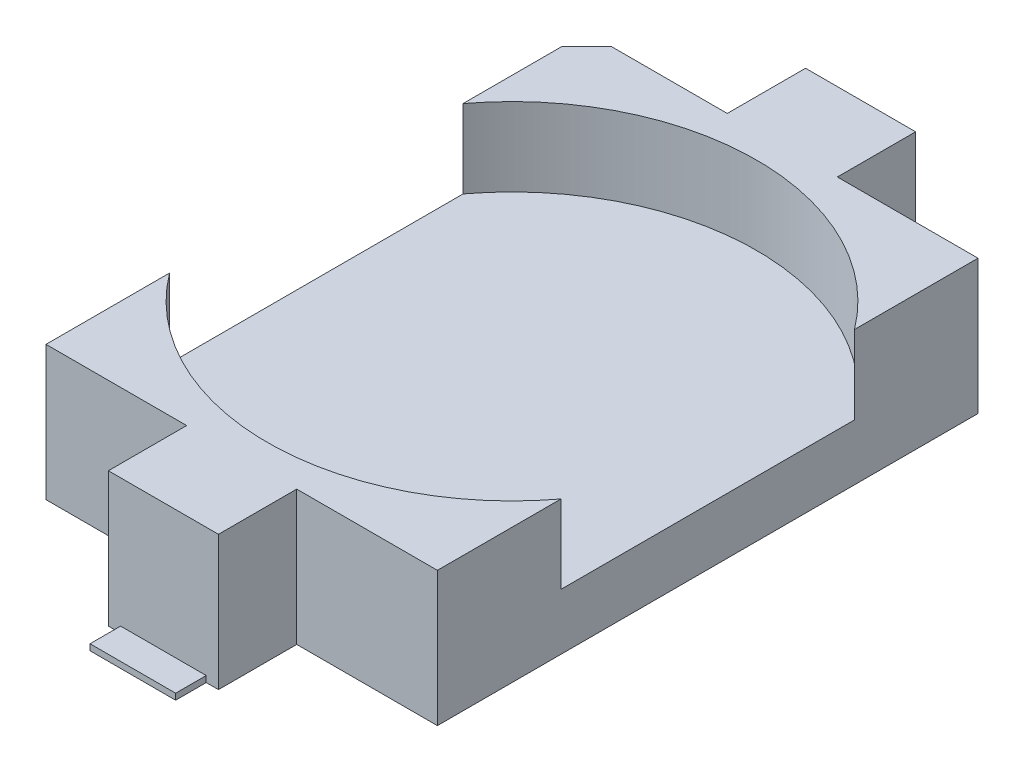
ISO-10303-21;
HEADER;
FILE_DESCRIPTION(('STEP AP214'),'2;1');
FILE_NAME('part.step','',(''),(''),'','','');
FILE_SCHEMA(('AUTOMOTIVE_DESIGN { 1 0 10303 214 1 1 1 1 }'));
ENDSEC;
DATA;
#1=APPLICATION_CONTEXT('core data for automotive mechanical design processes');
#2=APPLICATION_PROTOCOL_DEFINITION('international standard','automotive_design',2000,#1);
#3=PRODUCT_CONTEXT('',#1,'mechanical');
#4=PRODUCT('Part','Part','',(#3));
#5=PRODUCT_RELATED_PRODUCT_CATEGORY('part','',(#4));
#6=PRODUCT_DEFINITION_FORMATION('','',#4);
#7=PRODUCT_DEFINITION_CONTEXT('part definition',#1,'design');
#8=PRODUCT_DEFINITION('design','',#6,#7);
#9=PRODUCT_DEFINITION_SHAPE('','',#8);
#10=(LENGTH_UNIT() NAMED_UNIT(*) SI_UNIT(.MILLI.,.METRE.));
#11=(NAMED_UNIT(*) PLANE_ANGLE_UNIT() SI_UNIT($,.RADIAN.));
#12=(NAMED_UNIT(*) SI_UNIT($,.STERADIAN.) SOLID_ANGLE_UNIT());
#13=UNCERTAINTY_MEASURE_WITH_UNIT(LENGTH_MEASURE(1.E-05),#10,'distance_accuracy_value','');
#14=(GEOMETRIC_REPRESENTATION_CONTEXT(3) GLOBAL_UNCERTAINTY_ASSIGNED_CONTEXT((#13)) GLOBAL_UNIT_ASSIGNED_CONTEXT((#10,
#11,#12)) REPRESENTATION_CONTEXT('',''));
#15=CARTESIAN_POINT('',(0.,0.,0.));
#16=DIRECTION('',(0.,0.,1.));
#17=DIRECTION('',(1.,0.,0.));
#18=AXIS2_PLACEMENT_3D('',#15,#16,#17);
#19=CARTESIAN_POINT('',(0.,5.5,0.));
#20=DIRECTION('',(0.,1.,0.));
#21=DIRECTION('',(0.,0.,1.));
#22=AXIS2_PLACEMENT_3D('',#19,#20,#21);
#23=PLANE('',#22);
#24=DIRECTION('',(1.,0.,0.));
#25=VECTOR('',#24,1.);
#26=CARTESIAN_POINT('',(0.,5.5,-11.0499999999999));
#27=LINE('',#26,#25);
#28=CARTESIAN_POINT('',(-7.00000000000004,5.5,-11.0499999999999));
#29=VERTEX_POINT('',#28);
#30=CARTESIAN_POINT('',(-2.25,5.5,-11.0499999999999));
#31=VERTEX_POINT('',#30);
#32=EDGE_CURVE('E309',#29,#31,#27,.T.);
#33=ORIENTED_EDGE('',*,*,#32,.F.);
#34=DIRECTION('',(-0.707106781186549,0.,0.707106781186546));
#35=VECTOR('',#34,1.);
#36=CARTESIAN_POINT('',(-9.02499999999995,5.5,-9.02499999999998));
#37=LINE('',#36,#35);
#38=CARTESIAN_POINT('',(-8.00000000000005,5.5,-10.0499999999999));
#39=VERTEX_POINT('',#38);
#40=EDGE_CURVE('E47',#29,#39,#37,.T.);
#41=ORIENTED_EDGE('',*,*,#40,.T.);
#42=DIRECTION('',(0.,0.,1.));
#43=VECTOR('',#42,1.);
#44=CARTESIAN_POINT('',(-8.00000000000005,5.5,0.));
#45=LINE('',#44,#43);
#46=CARTESIAN_POINT('',(-8.00000000000005,5.5,-5.99999999999994));
#47=VERTEX_POINT('',#46);
#48=EDGE_CURVE('E312',#39,#47,#45,.T.);
#49=ORIENTED_EDGE('',*,*,#48,.T.);
#50=CARTESIAN_POINT('',(0.,5.5,0.));
#51=DIRECTION('',(0.,1.,0.));
#52=DIRECTION('',(0.,0.,1.));
#53=AXIS2_PLACEMENT_3D('',#50,#51,#52);
#54=CIRCLE('',#53,10.);
#55=CARTESIAN_POINT('',(7.99999999999995,5.5,-6.00000000000006));
#56=VERTEX_POINT('',#55);
#57=EDGE_CURVE('E376',#56,#47,#54,.T.);
#58=ORIENTED_EDGE('',*,*,#57,.F.);
#59=DIRECTION('',(0.,0.,1.));
#60=VECTOR('',#59,1.);
#61=CARTESIAN_POINT('',(7.99999999999995,5.5,0.));
#62=LINE('',#61,#60);
#63=CARTESIAN_POINT('',(7.99999999999995,5.5,-11.0499999999999));
#64=VERTEX_POINT('',#63);
#65=EDGE_CURVE('E294',#64,#56,#62,.T.);
#66=ORIENTED_EDGE('',*,*,#65,.F.);
#67=DIRECTION('',(1.,0.,0.));
#68=VECTOR('',#67,1.);
#69=CARTESIAN_POINT('',(0.,5.5,-11.0499999999999));
#70=LINE('',#69,#68);
#71=CARTESIAN_POINT('',(2.25,5.5,-11.0499999999999));
#72=VERTEX_POINT('',#71);
#73=EDGE_CURVE('E297',#72,#64,#70,.T.);
#74=ORIENTED_EDGE('',*,*,#73,.F.);
#75=DIRECTION('',(0.,0.,1.));
#76=VECTOR('',#75,1.);
#77=CARTESIAN_POINT('',(2.25,5.5,0.));
#78=LINE('',#77,#76);
#79=CARTESIAN_POINT('',(2.25,5.5,-14.25));
#80=VERTEX_POINT('',#79);
#81=EDGE_CURVE('E300',#80,#72,#78,.T.);
#82=ORIENTED_EDGE('',*,*,#81,.F.);
#83=DIRECTION('',(1.,0.,0.));
#84=VECTOR('',#83,1.);
#85=CARTESIAN_POINT('',(0.,5.5,-14.25));
#86=LINE('',#85,#84);
#87=CARTESIAN_POINT('',(-2.25,5.5,-14.25));
#88=VERTEX_POINT('',#87);
#89=EDGE_CURVE('E303',#88,#80,#86,.T.);
#90=ORIENTED_EDGE('',*,*,#89,.F.);
#91=DIRECTION('',(0.,0.,1.));
#92=VECTOR('',#91,1.);
#93=CARTESIAN_POINT('',(-2.25,5.5,0.));
#94=LINE('',#93,#92);
#95=EDGE_CURVE('E306',#88,#31,#94,.T.);
#96=ORIENTED_EDGE('',*,*,#95,.T.);
#97=EDGE_LOOP('',(#33,#41,#49,#58,#66,#74,#82,#90,#96));
#98=FACE_BOUND('',#97,.T.);
#99=ADVANCED_FACE('F38',(#98),#23,.T.);
#100=CARTESIAN_POINT('',(0.,5.5,11.0500000000001));
#101=DIRECTION('',(0.,0.,-1.));
#102=DIRECTION('',(-1.,0.,0.));
#103=AXIS2_PLACEMENT_3D('',#100,#101,#102);
#104=PLANE('',#103);
#105=DIRECTION('',(1.,0.,0.));
#106=VECTOR('',#105,1.);
#107=CARTESIAN_POINT('',(0.,0.,11.0500000000001));
#108=LINE('',#107,#106);
#109=CARTESIAN_POINT('',(-8.00000000000004,0.,11.0500000000001));
#110=VERTEX_POINT('',#109);
#111=CARTESIAN_POINT('',(-2.25,0.,11.0500000000001));
#112=VERTEX_POINT('',#111);
#113=EDGE_CURVE('E278',#110,#112,#108,.T.);
#114=ORIENTED_EDGE('',*,*,#113,.T.);
#115=DIRECTION('',(0.,-1.,0.));
#116=VECTOR('',#115,1.);
#117=CARTESIAN_POINT('',(-2.25,5.5,11.0500000000001));
#118=LINE('',#117,#116);
#119=CARTESIAN_POINT('',(-2.25,5.5,11.0500000000001));
#120=VERTEX_POINT('',#119);
#121=EDGE_CURVE('E371',#120,#112,#118,.T.);
#122=ORIENTED_EDGE('',*,*,#121,.F.);
#123=DIRECTION('',(1.,0.,0.));
#124=VECTOR('',#123,1.);
#125=CARTESIAN_POINT('',(0.,5.5,11.0500000000001));
#126=LINE('',#125,#124);
#127=CARTESIAN_POINT('',(-8.00000000000004,5.5,11.0500000000001));
#128=VERTEX_POINT('',#127);
#129=EDGE_CURVE('E279',#128,#120,#126,.T.);
#130=ORIENTED_EDGE('',*,*,#129,.F.);
#131=DIRECTION('',(0.,-1.,0.));
#132=VECTOR('',#131,1.);
#133=CARTESIAN_POINT('',(-8.00000000000004,5.5,11.0500000000001));
#134=LINE('',#133,#132);
#135=EDGE_CURVE('E314',#128,#110,#134,.T.);
#136=ORIENTED_EDGE('',*,*,#135,.T.);
#137=EDGE_LOOP('',(#114,#122,#130,#136));
#138=FACE_BOUND('',#137,.T.);
#139=ADVANCED_FACE('F472',(#138),#104,.F.);
#140=CARTESIAN_POINT('',(-2.25,5.5,0.));
#141=DIRECTION('',(1.,0.,0.));
#142=DIRECTION('',(0.,0.,-1.));
#143=AXIS2_PLACEMENT_3D('',#140,#141,#142);
#144=PLANE('',#143);
#145=DIRECTION('',(0.,0.,1.));
#146=VECTOR('',#145,1.);
#147=CARTESIAN_POINT('',(-2.25,0.,0.));
#148=LINE('',#147,#146);
#149=CARTESIAN_POINT('',(-2.25,0.,14.25));
#150=VERTEX_POINT('',#149);
#151=EDGE_CURVE('E317',#112,#150,#148,.T.);
#152=ORIENTED_EDGE('',*,*,#151,.T.);
#153=DIRECTION('',(0.,-1.,0.));
#154=VECTOR('',#153,1.);
#155=CARTESIAN_POINT('',(-2.25,5.5,14.25));
#156=LINE('',#155,#154);
#157=CARTESIAN_POINT('',(-2.25,5.5,14.25));
#158=VERTEX_POINT('',#157);
#159=EDGE_CURVE('E368',#158,#150,#156,.T.);
#160=ORIENTED_EDGE('',*,*,#159,.F.);
#161=DIRECTION('',(0.,0.,1.));
#162=VECTOR('',#161,1.);
#163=CARTESIAN_POINT('',(-2.25,5.5,0.));
#164=LINE('',#163,#162);
#165=EDGE_CURVE('E282',#120,#158,#164,.T.);
#166=ORIENTED_EDGE('',*,*,#165,.F.);
#167=ORIENTED_EDGE('',*,*,#121,.T.);
#168=EDGE_LOOP('',(#152,#160,#166,#167));
#169=FACE_BOUND('',#168,.T.);
#170=ADVANCED_FACE('F478',(#169),#144,.F.);
#171=CARTESIAN_POINT('',(0.,5.5,14.25));
#172=DIRECTION('',(0.,0.,-1.));
#173=DIRECTION('',(-1.,0.,0.));
#174=AXIS2_PLACEMENT_3D('',#171,#172,#173);
#175=PLANE('',#174);
#176=DIRECTION('',(-1.,0.,0.));
#177=VECTOR('',#176,1.);
#178=CARTESIAN_POINT('',(0.,0.25,14.25));
#179=LINE('',#178,#177);
#180=CARTESIAN_POINT('',(1.75,0.25,14.25));
#181=VERTEX_POINT('',#180);
#182=CARTESIAN_POINT('',(-1.75,0.25,14.25));
#183=VERTEX_POINT('',#182);
#184=EDGE_CURVE('E58',#181,#183,#179,.T.);
#185=ORIENTED_EDGE('',*,*,#184,.F.);
#186=DIRECTION('',(0.,-1.,0.));
#187=VECTOR('',#186,1.);
#188=CARTESIAN_POINT('',(1.75,5.5,14.25));
#189=LINE('',#188,#187);
#190=CARTESIAN_POINT('',(1.75,0.,14.25));
#191=VERTEX_POINT('',#190);
#192=EDGE_CURVE('E211',#181,#191,#189,.T.);
#193=ORIENTED_EDGE('',*,*,#192,.T.);
#194=DIRECTION('',(1.,0.,0.));
#195=VECTOR('',#194,1.);
#196=CARTESIAN_POINT('',(0.,0.,14.25));
#197=LINE('',#196,#195);
#198=CARTESIAN_POINT('',(2.25,0.,14.25));
#199=VERTEX_POINT('',#198);
#200=EDGE_CURVE('E319',#191,#199,#197,.T.);
#201=ORIENTED_EDGE('',*,*,#200,.T.);
#202=DIRECTION('',(0.,-1.,0.));
#203=VECTOR('',#202,1.);
#204=CARTESIAN_POINT('',(2.25,5.5,14.25));
#205=LINE('',#204,#203);
#206=CARTESIAN_POINT('',(2.25,5.5,14.25));
#207=VERTEX_POINT('',#206);
#208=EDGE_CURVE('E365',#207,#199,#205,.T.);
#209=ORIENTED_EDGE('',*,*,#208,.F.);
#210=DIRECTION('',(1.,0.,0.));
#211=VECTOR('',#210,1.);
#212=CARTESIAN_POINT('',(0.,5.5,14.25));
#213=LINE('',#212,#211);
#214=EDGE_CURVE('E285',#158,#207,#213,.T.);
#215=ORIENTED_EDGE('',*,*,#214,.F.);
#216=ORIENTED_EDGE('',*,*,#159,.T.);
#217=CARTESIAN_POINT('',(-1.75,0.,14.25));
#218=VERTEX_POINT('',#217);
#219=EDGE_CURVE('E320',#150,#218,#197,.T.);
#220=ORIENTED_EDGE('',*,*,#219,.T.);
#221=DIRECTION('',(0.,1.,0.));
#222=VECTOR('',#221,1.);
#223=CARTESIAN_POINT('',(-1.75,5.5,14.25));
#224=LINE('',#223,#222);
#225=EDGE_CURVE('E54',#218,#183,#224,.T.);
#226=ORIENTED_EDGE('',*,*,#225,.T.);
#227=EDGE_LOOP('',(#185,#193,#201,#209,#215,#216,#220,#226));
#228=FACE_BOUND('',#227,.T.);
#229=ADVANCED_FACE('F456',(#228),#175,.F.);
#230=CARTESIAN_POINT('',(2.25,5.5,0.));
#231=DIRECTION('',(1.,0.,0.));
#232=DIRECTION('',(0.,0.,-1.));
#233=AXIS2_PLACEMENT_3D('',#230,#231,#232);
#234=PLANE('',#233);
#235=DIRECTION('',(0.,0.,1.));
#236=VECTOR('',#235,1.);
#237=CARTESIAN_POINT('',(2.25,0.,0.));
#238=LINE('',#237,#236);
#239=CARTESIAN_POINT('',(2.25,0.,11.0500000000001));
#240=VERTEX_POINT('',#239);
#241=EDGE_CURVE('E322',#240,#199,#238,.T.);
#242=ORIENTED_EDGE('',*,*,#241,.F.);
#243=DIRECTION('',(0.,-1.,0.));
#244=VECTOR('',#243,1.);
#245=CARTESIAN_POINT('',(2.25,5.5,11.0500000000001));
#246=LINE('',#245,#244);
#247=CARTESIAN_POINT('',(2.25,5.5,11.0500000000001));
#248=VERTEX_POINT('',#247);
#249=EDGE_CURVE('E363',#248,#240,#246,.T.);
#250=ORIENTED_EDGE('',*,*,#249,.F.);
#251=DIRECTION('',(0.,0.,1.));
#252=VECTOR('',#251,1.);
#253=CARTESIAN_POINT('',(2.25,5.5,0.));
#254=LINE('',#253,#252);
#255=EDGE_CURVE('E287',#248,#207,#254,.T.);
#256=ORIENTED_EDGE('',*,*,#255,.T.);
#257=ORIENTED_EDGE('',*,*,#208,.T.);
#258=EDGE_LOOP('',(#242,#250,#256,#257));
#259=FACE_BOUND('',#258,.T.);
#260=ADVANCED_FACE('F452',(#259),#234,.T.);
#261=CARTESIAN_POINT('',(0.,5.5,11.0500000000001));
#262=DIRECTION('',(0.,0.,-1.));
#263=DIRECTION('',(-1.,0.,0.));
#264=AXIS2_PLACEMENT_3D('',#261,#262,#263);
#265=PLANE('',#264);
#266=DIRECTION('',(1.,0.,0.));
#267=VECTOR('',#266,1.);
#268=CARTESIAN_POINT('',(0.,0.,11.0500000000001));
#269=LINE('',#268,#267);
#270=CARTESIAN_POINT('',(7.99999999999995,0.,11.0500000000001));
#271=VERTEX_POINT('',#270);
#272=EDGE_CURVE('E325',#240,#271,#269,.T.);
#273=ORIENTED_EDGE('',*,*,#272,.T.);
#274=DIRECTION('',(0.,-1.,0.));
#275=VECTOR('',#274,1.);
#276=CARTESIAN_POINT('',(7.99999999999995,5.5,11.0500000000001));
#277=LINE('',#276,#275);
#278=CARTESIAN_POINT('',(7.99999999999995,5.5,11.0500000000001));
#279=VERTEX_POINT('',#278);
#280=EDGE_CURVE('E361',#279,#271,#277,.T.);
#281=ORIENTED_EDGE('',*,*,#280,.F.);
#282=DIRECTION('',(1.,0.,0.));
#283=VECTOR('',#282,1.);
#284=CARTESIAN_POINT('',(0.,5.5,11.0500000000001));
#285=LINE('',#284,#283);
#286=EDGE_CURVE('E290',#248,#279,#285,.T.);
#287=ORIENTED_EDGE('',*,*,#286,.F.);
#288=ORIENTED_EDGE('',*,*,#249,.T.);
#289=EDGE_LOOP('',(#273,#281,#287,#288));
#290=FACE_BOUND('',#289,.T.);
#291=ADVANCED_FACE('F449',(#290),#265,.F.);
#292=CARTESIAN_POINT('',(7.99999999999995,5.5,0.));
#293=DIRECTION('',(1.,0.,0.));
#294=DIRECTION('',(0.,0.,-1.));
#295=AXIS2_PLACEMENT_3D('',#292,#293,#294);
#296=PLANE('',#295);
#297=DIRECTION('',(0.,1.,0.));
#298=VECTOR('',#297,1.);
#299=CARTESIAN_POINT('',(7.99999999999995,2.3,-6.00000000000006));
#300=LINE('',#299,#298);
#301=CARTESIAN_POINT('',(7.99999999999995,2.3,-6.00000000000006));
#302=VERTEX_POINT('',#301);
#303=EDGE_CURVE('E273',#302,#56,#300,.T.);
#304=ORIENTED_EDGE('',*,*,#303,.F.);
#305=DIRECTION('',(0.,0.,1.));
#306=VECTOR('',#305,1.);
#307=CARTESIAN_POINT('',(7.99999999999995,2.3,0.));
#308=LINE('',#307,#306);
#309=CARTESIAN_POINT('',(7.99999999999995,2.3,6.00000000000006));
#310=VERTEX_POINT('',#309);
#311=EDGE_CURVE('E275',#302,#310,#308,.T.);
#312=ORIENTED_EDGE('',*,*,#311,.T.);
#313=DIRECTION('',(0.,1.,0.));
#314=VECTOR('',#313,1.);
#315=CARTESIAN_POINT('',(7.99999999999995,2.3,6.00000000000006));
#316=LINE('',#315,#314);
#317=CARTESIAN_POINT('',(7.99999999999995,5.5,6.00000000000006));
#318=VERTEX_POINT('',#317);
#319=EDGE_CURVE('E271',#318,#310,#316,.F.);
#320=ORIENTED_EDGE('',*,*,#319,.F.);
#321=EDGE_CURVE('E293',#318,#279,#62,.T.);
#322=ORIENTED_EDGE('',*,*,#321,.T.);
#323=ORIENTED_EDGE('',*,*,#280,.T.);
#324=DIRECTION('',(0.,0.,1.));
#325=VECTOR('',#324,1.);
#326=CARTESIAN_POINT('',(7.99999999999995,0.,0.));
#327=LINE('',#326,#325);
#328=CARTESIAN_POINT('',(7.99999999999995,0.,-11.0499999999999));
#329=VERTEX_POINT('',#328);
#330=EDGE_CURVE('E328',#329,#271,#327,.T.);
#331=ORIENTED_EDGE('',*,*,#330,.F.);
#332=DIRECTION('',(0.,-1.,0.));
#333=VECTOR('',#332,1.);
#334=CARTESIAN_POINT('',(7.99999999999995,5.5,-11.0499999999999));
#335=LINE('',#334,#333);
#336=EDGE_CURVE('E359',#64,#329,#335,.T.);
#337=ORIENTED_EDGE('',*,*,#336,.F.);
#338=ORIENTED_EDGE('',*,*,#65,.T.);
#339=EDGE_LOOP('',(#304,#312,#320,#322,#323,#331,#337,#338));
#340=FACE_BOUND('',#339,.T.);
#341=ADVANCED_FACE('F443',(#340),#296,.T.);
#342=CARTESIAN_POINT('',(0.,5.5,-11.0499999999999));
#343=DIRECTION('',(0.,0.,-1.));
#344=DIRECTION('',(-1.,0.,0.));
#345=AXIS2_PLACEMENT_3D('',#342,#343,#344);
#346=PLANE('',#345);
#347=DIRECTION('',(1.,0.,0.));
#348=VECTOR('',#347,1.);
#349=CARTESIAN_POINT('',(0.,0.,-11.0499999999999));
#350=LINE('',#349,#348);
#351=CARTESIAN_POINT('',(2.25,0.,-11.0499999999999));
#352=VERTEX_POINT('',#351);
#353=EDGE_CURVE('E331',#352,#329,#350,.T.);
#354=ORIENTED_EDGE('',*,*,#353,.F.);
#355=DIRECTION('',(0.,-1.,0.));
#356=VECTOR('',#355,1.);
#357=CARTESIAN_POINT('',(2.25,5.5,-11.0499999999999));
#358=LINE('',#357,#356);
#359=EDGE_CURVE('E357',#72,#352,#358,.T.);
#360=ORIENTED_EDGE('',*,*,#359,.F.);
#361=ORIENTED_EDGE('',*,*,#73,.T.);
#362=ORIENTED_EDGE('',*,*,#336,.T.);
#363=EDGE_LOOP('',(#354,#360,#361,#362));
#364=FACE_BOUND('',#363,.T.);
#365=ADVANCED_FACE('F438',(#364),#346,.T.);
#366=CARTESIAN_POINT('',(2.25,5.5,0.));
#367=DIRECTION('',(1.,0.,0.));
#368=DIRECTION('',(0.,0.,-1.));
#369=AXIS2_PLACEMENT_3D('',#366,#367,#368);
#370=PLANE('',#369);
#371=DIRECTION('',(0.,0.,1.));
#372=VECTOR('',#371,1.);
#373=CARTESIAN_POINT('',(2.25,0.,0.));
#374=LINE('',#373,#372);
#375=CARTESIAN_POINT('',(2.25,0.,-14.25));
#376=VERTEX_POINT('',#375);
#377=EDGE_CURVE('E334',#376,#352,#374,.T.);
#378=ORIENTED_EDGE('',*,*,#377,.F.);
#379=DIRECTION('',(0.,-1.,0.));
#380=VECTOR('',#379,1.);
#381=CARTESIAN_POINT('',(2.25,5.5,-14.25));
#382=LINE('',#381,#380);
#383=EDGE_CURVE('E354',#80,#376,#382,.T.);
#384=ORIENTED_EDGE('',*,*,#383,.F.);
#385=ORIENTED_EDGE('',*,*,#81,.T.);
#386=ORIENTED_EDGE('',*,*,#359,.T.);
#387=EDGE_LOOP('',(#378,#384,#385,#386));
#388=FACE_BOUND('',#387,.T.);
#389=ADVANCED_FACE('F433',(#388),#370,.T.);
#390=CARTESIAN_POINT('',(0.,5.5,-14.25));
#391=DIRECTION('',(0.,0.,-1.));
#392=DIRECTION('',(-1.,0.,0.));
#393=AXIS2_PLACEMENT_3D('',#390,#391,#392);
#394=PLANE('',#393);
#395=DIRECTION('',(0.,-1.,0.));
#396=VECTOR('',#395,1.);
#397=CARTESIAN_POINT('',(1.75,5.5,-14.25));
#398=LINE('',#397,#396);
#399=CARTESIAN_POINT('',(1.75,0.25,-14.25));
#400=VERTEX_POINT('',#399);
#401=CARTESIAN_POINT('',(1.75,0.,-14.25));
#402=VERTEX_POINT('',#401);
#403=EDGE_CURVE('E256',#400,#402,#398,.T.);
#404=ORIENTED_EDGE('',*,*,#403,.F.);
#405=DIRECTION('',(-1.,0.,0.));
#406=VECTOR('',#405,1.);
#407=CARTESIAN_POINT('',(0.,0.25,-14.25));
#408=LINE('',#407,#406);
#409=CARTESIAN_POINT('',(-1.75,0.25,-14.25));
#410=VERTEX_POINT('',#409);
#411=EDGE_CURVE('E11',#400,#410,#408,.T.);
#412=ORIENTED_EDGE('',*,*,#411,.T.);
#413=DIRECTION('',(0.,1.,0.));
#414=VECTOR('',#413,1.);
#415=CARTESIAN_POINT('',(-1.75,5.5,-14.25));
#416=LINE('',#415,#414);
#417=CARTESIAN_POINT('',(-1.75,0.,-14.25));
#418=VERTEX_POINT('',#417);
#419=EDGE_CURVE('E249',#418,#410,#416,.T.);
#420=ORIENTED_EDGE('',*,*,#419,.F.);
#421=DIRECTION('',(1.,0.,0.));
#422=VECTOR('',#421,1.);
#423=CARTESIAN_POINT('',(0.,0.,-14.25));
#424=LINE('',#423,#422);
#425=CARTESIAN_POINT('',(-2.25,0.,-14.25));
#426=VERTEX_POINT('',#425);
#427=EDGE_CURVE('E338',#426,#418,#424,.T.);
#428=ORIENTED_EDGE('',*,*,#427,.F.);
#429=DIRECTION('',(0.,-1.,0.));
#430=VECTOR('',#429,1.);
#431=CARTESIAN_POINT('',(-2.25,5.5,-14.25));
#432=LINE('',#431,#430);
#433=EDGE_CURVE('E352',#88,#426,#432,.T.);
#434=ORIENTED_EDGE('',*,*,#433,.F.);
#435=ORIENTED_EDGE('',*,*,#89,.T.);
#436=ORIENTED_EDGE('',*,*,#383,.T.);
#437=EDGE_CURVE('E337',#402,#376,#424,.T.);
#438=ORIENTED_EDGE('',*,*,#437,.F.);
#439=EDGE_LOOP('',(#404,#412,#420,#428,#434,#435,#436,#438));
#440=FACE_BOUND('',#439,.T.);
#441=ADVANCED_FACE('F413',(#440),#394,.T.);
#442=CARTESIAN_POINT('',(-2.25,5.5,0.));
#443=DIRECTION('',(1.,0.,0.));
#444=DIRECTION('',(0.,0.,-1.));
#445=AXIS2_PLACEMENT_3D('',#442,#443,#444);
#446=PLANE('',#445);
#447=DIRECTION('',(0.,0.,1.));
#448=VECTOR('',#447,1.);
#449=CARTESIAN_POINT('',(-2.25,0.,0.));
#450=LINE('',#449,#448);
#451=CARTESIAN_POINT('',(-2.25,0.,-11.0499999999999));
#452=VERTEX_POINT('',#451);
#453=EDGE_CURVE('E341',#426,#452,#450,.T.);
#454=ORIENTED_EDGE('',*,*,#453,.T.);
#455=DIRECTION('',(0.,-1.,0.));
#456=VECTOR('',#455,1.);
#457=CARTESIAN_POINT('',(-2.25,5.5,-11.0499999999999));
#458=LINE('',#457,#456);
#459=EDGE_CURVE('E349',#31,#452,#458,.T.);
#460=ORIENTED_EDGE('',*,*,#459,.F.);
#461=ORIENTED_EDGE('',*,*,#95,.F.);
#462=ORIENTED_EDGE('',*,*,#433,.T.);
#463=EDGE_LOOP('',(#454,#460,#461,#462));
#464=FACE_BOUND('',#463,.T.);
#465=ADVANCED_FACE('F408',(#464),#446,.F.);
#466=CARTESIAN_POINT('',(0.,5.5,-11.0499999999999));
#467=DIRECTION('',(0.,0.,-1.));
#468=DIRECTION('',(-1.,0.,0.));
#469=AXIS2_PLACEMENT_3D('',#466,#467,#468);
#470=PLANE('',#469);
#471=DIRECTION('',(1.,0.,0.));
#472=VECTOR('',#471,1.);
#473=CARTESIAN_POINT('',(0.,0.,-11.0499999999999));
#474=LINE('',#473,#472);
#475=CARTESIAN_POINT('',(-7.00000000000004,0.,-11.0499999999999));
#476=VERTEX_POINT('',#475);
#477=EDGE_CURVE('E344',#476,#452,#474,.T.);
#478=ORIENTED_EDGE('',*,*,#477,.F.);
#479=DIRECTION('',(0.,1.,0.));
#480=VECTOR('',#479,1.);
#481=CARTESIAN_POINT('',(-7.00000000000004,5.5,-11.0499999999999));
#482=LINE('',#481,#480);
#483=EDGE_CURVE('E384',#476,#29,#482,.T.);
#484=ORIENTED_EDGE('',*,*,#483,.T.);
#485=ORIENTED_EDGE('',*,*,#32,.T.);
#486=ORIENTED_EDGE('',*,*,#459,.T.);
#487=EDGE_LOOP('',(#478,#484,#485,#486));
#488=FACE_BOUND('',#487,.T.);
#489=ADVANCED_FACE('F404',(#488),#470,.T.);
#490=CARTESIAN_POINT('',(-8.00000000000005,5.5,0.));
#491=DIRECTION('',(1.,0.,0.));
#492=DIRECTION('',(0.,0.,-1.));
#493=AXIS2_PLACEMENT_3D('',#490,#491,#492);
#494=PLANE('',#493);
#495=ORIENTED_EDGE('',*,*,#48,.F.);
#496=DIRECTION('',(0.,-1.,0.));
#497=VECTOR('',#496,1.);
#498=CARTESIAN_POINT('',(-8.00000000000005,0.,-10.0499999999999));
#499=LINE('',#498,#497);
#500=CARTESIAN_POINT('',(-8.00000000000005,0.,-10.0499999999999));
#501=VERTEX_POINT('',#500);
#502=EDGE_CURVE('E379',#39,#501,#499,.T.);
#503=ORIENTED_EDGE('',*,*,#502,.T.);
#504=DIRECTION('',(0.,0.,1.));
#505=VECTOR('',#504,1.);
#506=CARTESIAN_POINT('',(-8.00000000000005,0.,0.));
#507=LINE('',#506,#505);
#508=EDGE_CURVE('E283',#501,#110,#507,.T.);
#509=ORIENTED_EDGE('',*,*,#508,.T.);
#510=ORIENTED_EDGE('',*,*,#135,.F.);
#511=CARTESIAN_POINT('',(-8.00000000000004,5.5,5.99999999999994));
#512=VERTEX_POINT('',#511);
#513=EDGE_CURVE('E311',#512,#128,#45,.T.);
#514=ORIENTED_EDGE('',*,*,#513,.F.);
#515=DIRECTION('',(0.,1.,0.));
#516=VECTOR('',#515,1.);
#517=CARTESIAN_POINT('',(-8.00000000000004,2.3,5.99999999999994));
#518=LINE('',#517,#516);
#519=CARTESIAN_POINT('',(-8.00000000000004,2.3,5.99999999999994));
#520=VERTEX_POINT('',#519);
#521=EDGE_CURVE('E265',#512,#520,#518,.F.);
#522=ORIENTED_EDGE('',*,*,#521,.T.);
#523=DIRECTION('',(0.,0.,1.));
#524=VECTOR('',#523,1.);
#525=CARTESIAN_POINT('',(-8.00000000000005,2.3,0.));
#526=LINE('',#525,#524);
#527=CARTESIAN_POINT('',(-8.00000000000005,2.3,-5.99999999999994));
#528=VERTEX_POINT('',#527);
#529=EDGE_CURVE('E377',#528,#520,#526,.T.);
#530=ORIENTED_EDGE('',*,*,#529,.F.);
#531=DIRECTION('',(0.,1.,0.));
#532=VECTOR('',#531,1.);
#533=CARTESIAN_POINT('',(-8.00000000000005,2.3,-5.99999999999994));
#534=LINE('',#533,#532);
#535=EDGE_CURVE('E268',#528,#47,#534,.T.);
#536=ORIENTED_EDGE('',*,*,#535,.T.);
#537=EDGE_LOOP('',(#495,#503,#509,#510,#514,#522,#530,#536));
#538=FACE_BOUND('',#537,.T.);
#539=ADVANCED_FACE('F395',(#538),#494,.F.);
#540=EDGE_CURVE('E374',#512,#318,#54,.T.);
#541=ORIENTED_EDGE('',*,*,#540,.F.);
#542=ORIENTED_EDGE('',*,*,#513,.T.);
#543=ORIENTED_EDGE('',*,*,#129,.T.);
#544=ORIENTED_EDGE('',*,*,#165,.T.);
#545=ORIENTED_EDGE('',*,*,#214,.T.);
#546=ORIENTED_EDGE('',*,*,#255,.F.);
#547=ORIENTED_EDGE('',*,*,#286,.T.);
#548=ORIENTED_EDGE('',*,*,#321,.F.);
#549=EDGE_LOOP('',(#541,#542,#543,#544,#545,#546,#547,#548));
#550=FACE_BOUND('',#549,.T.);
#551=ADVANCED_FACE('F474',(#550),#23,.T.);
#552=CARTESIAN_POINT('',(0.,0.,0.));
#553=DIRECTION('',(0.,1.,0.));
#554=DIRECTION('',(0.,0.,1.));
#555=AXIS2_PLACEMENT_3D('',#552,#553,#554);
#556=PLANE('',#555);
#557=ORIENTED_EDGE('',*,*,#427,.T.);
#558=DIRECTION('',(0.,0.,-1.));
#559=VECTOR('',#558,1.);
#560=CARTESIAN_POINT('',(-1.75,0.,15.5));
#561=LINE('',#560,#559);
#562=CARTESIAN_POINT('',(-1.75,0.,-15.5));
#563=VERTEX_POINT('',#562);
#564=EDGE_CURVE('E241',#418,#563,#561,.T.);
#565=ORIENTED_EDGE('',*,*,#564,.T.);
#566=DIRECTION('',(1.,0.,0.));
#567=VECTOR('',#566,1.);
#568=CARTESIAN_POINT('',(-1.75,0.,-15.5));
#569=LINE('',#568,#567);
#570=CARTESIAN_POINT('',(1.75,0.,-15.5));
#571=VERTEX_POINT('',#570);
#572=EDGE_CURVE('E215',#563,#571,#569,.T.);
#573=ORIENTED_EDGE('',*,*,#572,.T.);
#574=DIRECTION('',(0.,0.,1.));
#575=VECTOR('',#574,1.);
#576=CARTESIAN_POINT('',(1.75,0.,15.5));
#577=LINE('',#576,#575);
#578=EDGE_CURVE('E237',#571,#402,#577,.T.);
#579=ORIENTED_EDGE('',*,*,#578,.T.);
#580=ORIENTED_EDGE('',*,*,#437,.T.);
#581=ORIENTED_EDGE('',*,*,#377,.T.);
#582=ORIENTED_EDGE('',*,*,#353,.T.);
#583=ORIENTED_EDGE('',*,*,#330,.T.);
#584=ORIENTED_EDGE('',*,*,#272,.F.);
#585=ORIENTED_EDGE('',*,*,#241,.T.);
#586=ORIENTED_EDGE('',*,*,#200,.F.);
#587=CARTESIAN_POINT('',(1.75,0.,15.5));
#588=VERTEX_POINT('',#587);
#589=EDGE_CURVE('E239',#191,#588,#577,.T.);
#590=ORIENTED_EDGE('',*,*,#589,.T.);
#591=DIRECTION('',(-1.,0.,0.));
#592=VECTOR('',#591,1.);
#593=CARTESIAN_POINT('',(-1.75,0.,15.5));
#594=LINE('',#593,#592);
#595=CARTESIAN_POINT('',(-1.75,0.,15.5));
#596=VERTEX_POINT('',#595);
#597=EDGE_CURVE('E222',#588,#596,#594,.T.);
#598=ORIENTED_EDGE('',*,*,#597,.T.);
#599=EDGE_CURVE('E242',#596,#218,#561,.T.);
#600=ORIENTED_EDGE('',*,*,#599,.T.);
#601=ORIENTED_EDGE('',*,*,#219,.F.);
#602=ORIENTED_EDGE('',*,*,#151,.F.);
#603=ORIENTED_EDGE('',*,*,#113,.F.);
#604=ORIENTED_EDGE('',*,*,#508,.F.);
#605=DIRECTION('',(0.707106781186549,0.,-0.707106781186546));
#606=VECTOR('',#605,1.);
#607=CARTESIAN_POINT('',(-8.00000000000005,0.,-10.0499999999999));
#608=LINE('',#607,#606);
#609=EDGE_CURVE('E382',#501,#476,#608,.T.);
#610=ORIENTED_EDGE('',*,*,#609,.T.);
#611=ORIENTED_EDGE('',*,*,#477,.T.);
#612=ORIENTED_EDGE('',*,*,#453,.F.);
#613=EDGE_LOOP('',(#557,#565,#573,#579,#580,#581,#582,#583,#584,#585,#586,#590,#598,#600,#601,
#602,#603,#604,#610,#611,#612));
#614=FACE_BOUND('',#613,.T.);
#615=ADVANCED_FACE('F400',(#614),#556,.F.);
#616=CARTESIAN_POINT('',(0.,2.3,0.));
#617=DIRECTION('',(0.,1.,0.));
#618=DIRECTION('',(0.,0.,1.));
#619=AXIS2_PLACEMENT_3D('',#616,#617,#618);
#620=PLANE('',#619);
#621=CARTESIAN_POINT('',(0.,2.3,0.));
#622=DIRECTION('',(0.,1.,0.));
#623=DIRECTION('',(0.,0.,1.));
#624=AXIS2_PLACEMENT_3D('',#621,#622,#623);
#625=CIRCLE('',#624,10.);
#626=EDGE_CURVE('E264',#302,#528,#625,.T.);
#627=ORIENTED_EDGE('',*,*,#626,.T.);
#628=ORIENTED_EDGE('',*,*,#529,.T.);
#629=EDGE_CURVE('E261',#520,#310,#625,.T.);
#630=ORIENTED_EDGE('',*,*,#629,.T.);
#631=ORIENTED_EDGE('',*,*,#311,.F.);
#632=EDGE_LOOP('',(#627,#628,#630,#631));
#633=FACE_BOUND('',#632,.T.);
#634=ADVANCED_FACE('F488',(#633),#620,.T.);
#635=CARTESIAN_POINT('',(0.,2.3,0.));
#636=DIRECTION('',(0.,1.,0.));
#637=DIRECTION('',(0.,0.,1.));
#638=AXIS2_PLACEMENT_3D('',#635,#636,#637);
#639=CYLINDRICAL_SURFACE('',#638,10.);
#640=ORIENTED_EDGE('',*,*,#303,.T.);
#641=ORIENTED_EDGE('',*,*,#57,.T.);
#642=ORIENTED_EDGE('',*,*,#535,.F.);
#643=ORIENTED_EDGE('',*,*,#626,.F.);
#644=EDGE_LOOP('',(#640,#641,#642,#643));
#645=FACE_BOUND('',#644,.T.);
#646=ADVANCED_FACE('F619',(#645),#639,.F.);
#647=ORIENTED_EDGE('',*,*,#319,.T.);
#648=ORIENTED_EDGE('',*,*,#629,.F.);
#649=ORIENTED_EDGE('',*,*,#521,.F.);
#650=ORIENTED_EDGE('',*,*,#540,.T.);
#651=EDGE_LOOP('',(#647,#648,#649,#650));
#652=FACE_BOUND('',#651,.T.);
#653=ADVANCED_FACE('F538',(#652),#639,.F.);
#654=CARTESIAN_POINT('',(-8.00000000000005,5.5,-10.0499999999999));
#655=DIRECTION('',(-0.707106781186546,0.,-0.707106781186549));
#656=DIRECTION('',(0.,1.,0.));
#657=AXIS2_PLACEMENT_3D('',#654,#655,#656);
#658=PLANE('',#657);
#659=ORIENTED_EDGE('',*,*,#40,.F.);
#660=ORIENTED_EDGE('',*,*,#483,.F.);
#661=ORIENTED_EDGE('',*,*,#609,.F.);
#662=ORIENTED_EDGE('',*,*,#502,.F.);
#663=EDGE_LOOP('',(#659,#660,#661,#662));
#664=FACE_BOUND('',#663,.T.);
#665=ADVANCED_FACE('F41',(#664),#658,.T.);
#666=CARTESIAN_POINT('',(-1.75,0.25,-15.5));
#667=DIRECTION('',(0.,0.,-1.));
#668=DIRECTION('',(-1.,0.,0.));
#669=AXIS2_PLACEMENT_3D('',#666,#667,#668);
#670=PLANE('',#669);
#671=ORIENTED_EDGE('',*,*,#572,.F.);
#672=DIRECTION('',(0.,-1.,0.));
#673=VECTOR('',#672,1.);
#674=CARTESIAN_POINT('',(-1.75,0.25,-15.5));
#675=LINE('',#674,#673);
#676=CARTESIAN_POINT('',(-1.75,0.25,-15.5));
#677=VERTEX_POINT('',#676);
#678=EDGE_CURVE('E250',#677,#563,#675,.T.);
#679=ORIENTED_EDGE('',*,*,#678,.F.);
#680=DIRECTION('',(1.,0.,0.));
#681=VECTOR('',#680,1.);
#682=CARTESIAN_POINT('',(-1.75,0.25,-15.5));
#683=LINE('',#682,#681);
#684=CARTESIAN_POINT('',(1.75,0.25,-15.5));
#685=VERTEX_POINT('',#684);
#686=EDGE_CURVE('E224',#677,#685,#683,.T.);
#687=ORIENTED_EDGE('',*,*,#686,.T.);
#688=DIRECTION('',(0.,-1.,0.));
#689=VECTOR('',#688,1.);
#690=CARTESIAN_POINT('',(1.75,0.25,-15.5));
#691=LINE('',#690,#689);
#692=EDGE_CURVE('E247',#685,#571,#691,.T.);
#693=ORIENTED_EDGE('',*,*,#692,.T.);
#694=EDGE_LOOP('',(#671,#679,#687,#693));
#695=FACE_BOUND('',#694,.T.);
#696=ADVANCED_FACE('F424',(#695),#670,.T.);
#697=CARTESIAN_POINT('',(0.,0.25,0.));
#698=DIRECTION('',(0.,-1.,0.));
#699=DIRECTION('',(0.,0.,-1.));
#700=AXIS2_PLACEMENT_3D('',#697,#698,#699);
#701=PLANE('',#700);
#702=ORIENTED_EDGE('',*,*,#411,.F.);
#703=DIRECTION('',(0.,0.,1.));
#704=VECTOR('',#703,1.);
#705=CARTESIAN_POINT('',(1.75,0.25,15.5));
#706=LINE('',#705,#704);
#707=EDGE_CURVE('E214',#685,#400,#706,.T.);
#708=ORIENTED_EDGE('',*,*,#707,.F.);
#709=ORIENTED_EDGE('',*,*,#686,.F.);
#710=DIRECTION('',(0.,0.,-1.));
#711=VECTOR('',#710,1.);
#712=CARTESIAN_POINT('',(-1.75,0.25,15.5));
#713=LINE('',#712,#711);
#714=EDGE_CURVE('E230',#410,#677,#713,.T.);
#715=ORIENTED_EDGE('',*,*,#714,.F.);
#716=EDGE_LOOP('',(#702,#708,#709,#715));
#717=FACE_BOUND('',#716,.T.);
#718=ADVANCED_FACE('F420',(#717),#701,.F.);
#719=CARTESIAN_POINT('',(-1.75,0.25,15.5));
#720=DIRECTION('',(-1.,0.,0.));
#721=DIRECTION('',(0.,0.,1.));
#722=AXIS2_PLACEMENT_3D('',#719,#720,#721);
#723=PLANE('',#722);
#724=ORIENTED_EDGE('',*,*,#564,.F.);
#725=ORIENTED_EDGE('',*,*,#419,.T.);
#726=ORIENTED_EDGE('',*,*,#714,.T.);
#727=ORIENTED_EDGE('',*,*,#678,.T.);
#728=EDGE_LOOP('',(#724,#725,#726,#727));
#729=FACE_BOUND('',#728,.T.);
#730=ADVANCED_FACE('F416',(#729),#723,.T.);
#731=CARTESIAN_POINT('',(1.75,0.25,15.5));
#732=DIRECTION('',(1.,0.,0.));
#733=DIRECTION('',(0.,0.,-1.));
#734=AXIS2_PLACEMENT_3D('',#731,#732,#733);
#735=PLANE('',#734);
#736=ORIENTED_EDGE('',*,*,#707,.T.);
#737=ORIENTED_EDGE('',*,*,#403,.T.);
#738=ORIENTED_EDGE('',*,*,#578,.F.);
#739=ORIENTED_EDGE('',*,*,#692,.F.);
#740=EDGE_LOOP('',(#736,#737,#738,#739));
#741=FACE_BOUND('',#740,.T.);
#742=ADVANCED_FACE('F428',(#741),#735,.T.);
#743=CARTESIAN_POINT('',(1.75,0.25,15.5));
#744=VERTEX_POINT('',#743);
#745=EDGE_CURVE('E205',#181,#744,#706,.T.);
#746=ORIENTED_EDGE('',*,*,#745,.F.);
#747=ORIENTED_EDGE('',*,*,#184,.T.);
#748=CARTESIAN_POINT('',(-1.75,0.25,15.5));
#749=VERTEX_POINT('',#748);
#750=EDGE_CURVE('E229',#749,#183,#713,.T.);
#751=ORIENTED_EDGE('',*,*,#750,.F.);
#752=DIRECTION('',(-1.,0.,0.));
#753=VECTOR('',#752,1.);
#754=CARTESIAN_POINT('',(-1.75,0.25,15.5));
#755=LINE('',#754,#753);
#756=EDGE_CURVE('E220',#744,#749,#755,.T.);
#757=ORIENTED_EDGE('',*,*,#756,.F.);
#758=EDGE_LOOP('',(#746,#747,#751,#757));
#759=FACE_BOUND('',#758,.T.);
#760=ADVANCED_FACE('F227',(#759),#701,.F.);
#761=ORIENTED_EDGE('',*,*,#192,.F.);
#762=ORIENTED_EDGE('',*,*,#745,.T.);
#763=DIRECTION('',(0.,-1.,0.));
#764=VECTOR('',#763,1.);
#765=CARTESIAN_POINT('',(1.75,0.25,15.5));
#766=LINE('',#765,#764);
#767=EDGE_CURVE('E209',#744,#588,#766,.T.);
#768=ORIENTED_EDGE('',*,*,#767,.T.);
#769=ORIENTED_EDGE('',*,*,#589,.F.);
#770=EDGE_LOOP('',(#761,#762,#768,#769));
#771=FACE_BOUND('',#770,.T.);
#772=ADVANCED_FACE('F207',(#771),#735,.T.);
#773=ORIENTED_EDGE('',*,*,#225,.F.);
#774=ORIENTED_EDGE('',*,*,#599,.F.);
#775=DIRECTION('',(0.,-1.,0.));
#776=VECTOR('',#775,1.);
#777=CARTESIAN_POINT('',(-1.75,0.25,15.5));
#778=LINE('',#777,#776);
#779=EDGE_CURVE('E223',#749,#596,#778,.T.);
#780=ORIENTED_EDGE('',*,*,#779,.F.);
#781=ORIENTED_EDGE('',*,*,#750,.T.);
#782=EDGE_LOOP('',(#773,#774,#780,#781));
#783=FACE_BOUND('',#782,.T.);
#784=ADVANCED_FACE('F460',(#783),#723,.T.);
#785=CARTESIAN_POINT('',(-1.75,0.25,15.5));
#786=DIRECTION('',(0.,0.,1.));
#787=DIRECTION('',(1.,0.,0.));
#788=AXIS2_PLACEMENT_3D('',#785,#786,#787);
#789=PLANE('',#788);
#790=ORIENTED_EDGE('',*,*,#597,.F.);
#791=ORIENTED_EDGE('',*,*,#767,.F.);
#792=ORIENTED_EDGE('',*,*,#756,.T.);
#793=ORIENTED_EDGE('',*,*,#779,.T.);
#794=EDGE_LOOP('',(#790,#791,#792,#793));
#795=FACE_BOUND('',#794,.T.);
#796=ADVANCED_FACE('F219',(#795),#789,.T.);
#797=CLOSED_SHELL('',(#99,#139,#170,#229,#260,#291,#341,#365,#389,#441,#465,#489,#539,#551,#615,
#634,#646,#653,#665,#696,#718,#730,#742,#760,#772,#784,#796));
#798=MANIFOLD_SOLID_BREP('B2',#797);
#799=ADVANCED_BREP_SHAPE_REPRESENTATION('',(#18,#798),#14);
#800=SHAPE_DEFINITION_REPRESENTATION(#9,#799);
ENDSEC;
END-ISO-10303-21;
